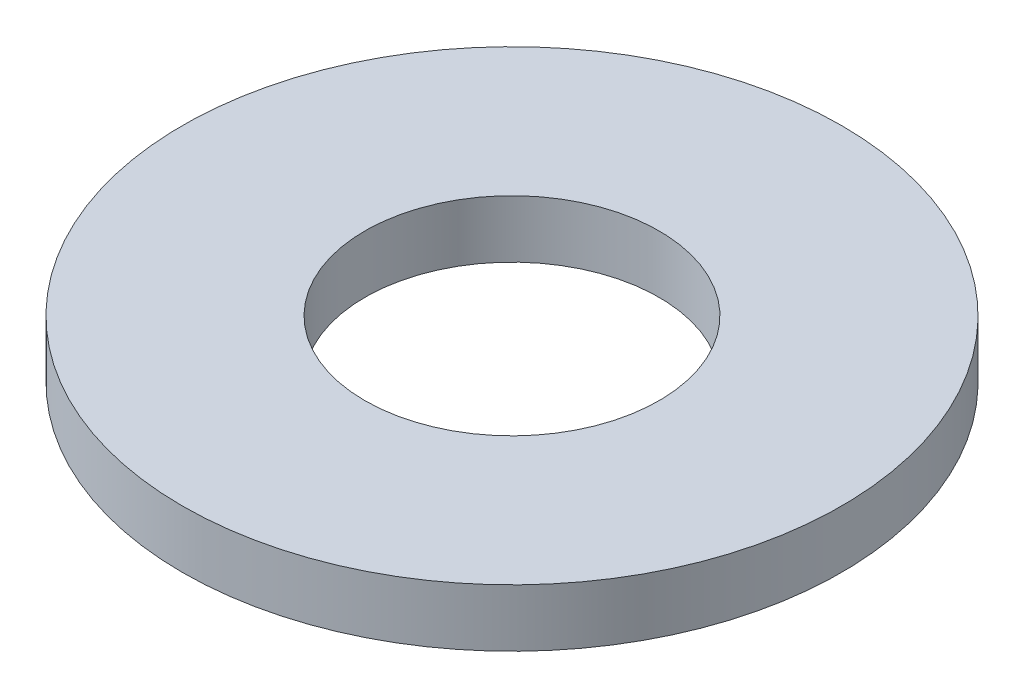
ISO-10303-21;
HEADER;
FILE_DESCRIPTION(('STEP AP214'),'2;1');
FILE_NAME('part.step','',(''),(''),'','','');
FILE_SCHEMA(('AUTOMOTIVE_DESIGN { 1 0 10303 214 1 1 1 1 }'));
ENDSEC;
DATA;
#1=APPLICATION_CONTEXT('core data for automotive mechanical design processes');
#2=APPLICATION_PROTOCOL_DEFINITION('international standard','automotive_design',2000,#1);
#3=PRODUCT_CONTEXT('',#1,'mechanical');
#4=PRODUCT('Part','Part','',(#3));
#5=PRODUCT_RELATED_PRODUCT_CATEGORY('part','',(#4));
#6=PRODUCT_DEFINITION_FORMATION('','',#4);
#7=PRODUCT_DEFINITION_CONTEXT('part definition',#1,'design');
#8=PRODUCT_DEFINITION('design','',#6,#7);
#9=PRODUCT_DEFINITION_SHAPE('','',#8);
#10=(LENGTH_UNIT() NAMED_UNIT(*) SI_UNIT(.MILLI.,.METRE.));
#11=(NAMED_UNIT(*) PLANE_ANGLE_UNIT() SI_UNIT($,.RADIAN.));
#12=(NAMED_UNIT(*) SI_UNIT($,.STERADIAN.) SOLID_ANGLE_UNIT());
#13=UNCERTAINTY_MEASURE_WITH_UNIT(LENGTH_MEASURE(1.E-05),#10,'distance_accuracy_value','');
#14=(GEOMETRIC_REPRESENTATION_CONTEXT(3) GLOBAL_UNCERTAINTY_ASSIGNED_CONTEXT((#13)) GLOBAL_UNIT_ASSIGNED_CONTEXT((#10,
#11,#12)) REPRESENTATION_CONTEXT('',''));
#15=CARTESIAN_POINT('',(0.,0.,0.));
#16=DIRECTION('',(0.,0.,1.));
#17=DIRECTION('',(1.,0.,0.));
#18=AXIS2_PLACEMENT_3D('',#15,#16,#17);
#19=CARTESIAN_POINT('',(0.,1.085,0.));
#20=DIRECTION('',(0.,1.,0.));
#21=DIRECTION('',(0.,0.,1.));
#22=AXIS2_PLACEMENT_3D('',#19,#20,#21);
#23=PLANE('',#22);
#24=CARTESIAN_POINT('',(0.,1.085,0.));
#25=DIRECTION('',(0.,1.,0.));
#26=DIRECTION('',(0.,0.,1.));
#27=AXIS2_PLACEMENT_3D('',#24,#25,#26);
#28=CIRCLE('',#27,12.425);
#29=CARTESIAN_POINT('',(0.,1.085,12.425));
#30=VERTEX_POINT('',#29);
#31=EDGE_CURVE('E10',#30,#30,#28,.T.);
#32=ORIENTED_EDGE('',*,*,#31,.T.);
#33=EDGE_LOOP('',(#32));
#34=FACE_BOUND('',#33,.T.);
#35=CARTESIAN_POINT('',(0.,1.085,0.));
#36=DIRECTION('',(0.,1.,0.));
#37=DIRECTION('',(0.,0.,1.));
#38=AXIS2_PLACEMENT_3D('',#35,#36,#37);
#39=CIRCLE('',#38,5.545);
#40=CARTESIAN_POINT('',(0.,1.085,5.545));
#41=VERTEX_POINT('',#40);
#42=EDGE_CURVE('E58',#41,#41,#39,.T.);
#43=ORIENTED_EDGE('',*,*,#42,.F.);
#44=EDGE_LOOP('',(#43));
#45=FACE_BOUND('',#44,.T.);
#46=ADVANCED_FACE('F43',(#34,#45),#23,.T.);
#47=CARTESIAN_POINT('',(0.,-1.085,0.));
#48=DIRECTION('',(0.,1.,0.));
#49=DIRECTION('',(0.,0.,1.));
#50=AXIS2_PLACEMENT_3D('',#47,#48,#49);
#51=PLANE('',#50);
#52=CARTESIAN_POINT('',(0.,-1.085,0.));
#53=DIRECTION('',(0.,1.,0.));
#54=DIRECTION('',(0.,0.,1.));
#55=AXIS2_PLACEMENT_3D('',#52,#53,#54);
#56=CIRCLE('',#55,12.425);
#57=CARTESIAN_POINT('',(0.,-1.085,12.425));
#58=VERTEX_POINT('',#57);
#59=EDGE_CURVE('E47',#58,#58,#56,.T.);
#60=ORIENTED_EDGE('',*,*,#59,.F.);
#61=EDGE_LOOP('',(#60));
#62=FACE_BOUND('',#61,.T.);
#63=CARTESIAN_POINT('',(0.,-1.085,0.));
#64=DIRECTION('',(0.,1.,0.));
#65=DIRECTION('',(0.,0.,1.));
#66=AXIS2_PLACEMENT_3D('',#63,#64,#65);
#67=CIRCLE('',#66,5.545);
#68=CARTESIAN_POINT('',(0.,-1.085,5.545));
#69=VERTEX_POINT('',#68);
#70=EDGE_CURVE('E60',#69,#69,#67,.T.);
#71=ORIENTED_EDGE('',*,*,#70,.T.);
#72=EDGE_LOOP('',(#71));
#73=FACE_BOUND('',#72,.T.);
#74=ADVANCED_FACE('F74',(#62,#73),#51,.F.);
#75=CARTESIAN_POINT('',(0.,1.085,0.));
#76=DIRECTION('',(0.,-1.,0.));
#77=DIRECTION('',(0.,0.,-1.));
#78=AXIS2_PLACEMENT_3D('',#75,#76,#77);
#79=CYLINDRICAL_SURFACE('',#78,12.425);
#80=ORIENTED_EDGE('',*,*,#31,.F.);
#81=EDGE_LOOP('',(#80));
#82=FACE_BOUND('',#81,.T.);
#83=ORIENTED_EDGE('',*,*,#59,.T.);
#84=EDGE_LOOP('',(#83));
#85=FACE_BOUND('',#84,.T.);
#86=ADVANCED_FACE('F45',(#82,#85),#79,.T.);
#87=CARTESIAN_POINT('',(0.,1.085,0.));
#88=DIRECTION('',(0.,-1.,0.));
#89=DIRECTION('',(0.,0.,-1.));
#90=AXIS2_PLACEMENT_3D('',#87,#88,#89);
#91=CYLINDRICAL_SURFACE('',#90,5.545);
#92=ORIENTED_EDGE('',*,*,#42,.T.);
#93=EDGE_LOOP('',(#92));
#94=FACE_BOUND('',#93,.T.);
#95=ORIENTED_EDGE('',*,*,#70,.F.);
#96=EDGE_LOOP('',(#95));
#97=FACE_BOUND('',#96,.T.);
#98=ADVANCED_FACE('F70',(#94,#97),#91,.F.);
#99=CLOSED_SHELL('',(#46,#74,#86,#98));
#100=MANIFOLD_SOLID_BREP('B2',#99);
#101=ADVANCED_BREP_SHAPE_REPRESENTATION('',(#18,#100),#14);
#102=SHAPE_DEFINITION_REPRESENTATION(#9,#101);
ENDSEC;
END-ISO-10303-21;
